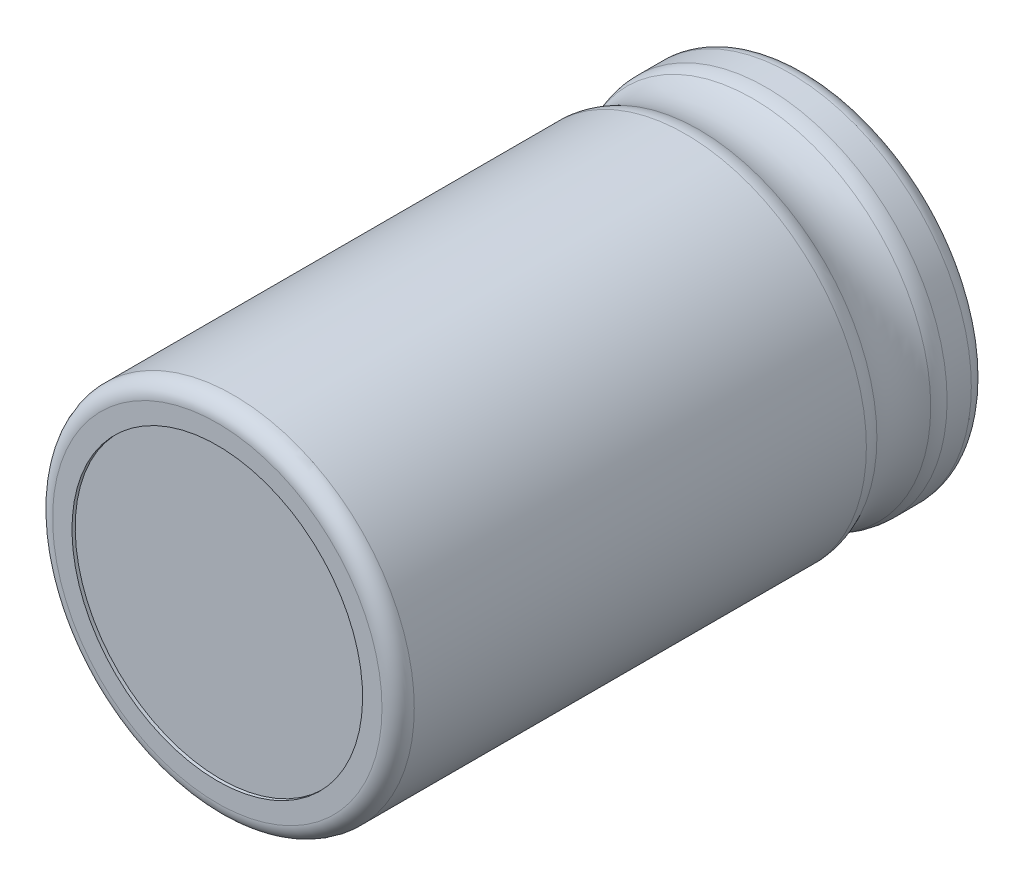
ISO-10303-21;
HEADER;
FILE_DESCRIPTION(('STEP AP214'),'2;1');
FILE_NAME('part.step','',(''),(''),'','','');
FILE_SCHEMA(('AUTOMOTIVE_DESIGN { 1 0 10303 214 1 1 1 1 }'));
ENDSEC;
DATA;
#1=APPLICATION_CONTEXT('core data for automotive mechanical design processes');
#2=APPLICATION_PROTOCOL_DEFINITION('international standard','automotive_design',2000,#1);
#3=PRODUCT_CONTEXT('',#1,'mechanical');
#4=PRODUCT('Part','Part','',(#3));
#5=PRODUCT_RELATED_PRODUCT_CATEGORY('part','',(#4));
#6=PRODUCT_DEFINITION_FORMATION('','',#4);
#7=PRODUCT_DEFINITION_CONTEXT('part definition',#1,'design');
#8=PRODUCT_DEFINITION('design','',#6,#7);
#9=PRODUCT_DEFINITION_SHAPE('','',#8);
#10=(LENGTH_UNIT() NAMED_UNIT(*) SI_UNIT(.MILLI.,.METRE.));
#11=(NAMED_UNIT(*) PLANE_ANGLE_UNIT() SI_UNIT($,.RADIAN.));
#12=(NAMED_UNIT(*) SI_UNIT($,.STERADIAN.) SOLID_ANGLE_UNIT());
#13=UNCERTAINTY_MEASURE_WITH_UNIT(LENGTH_MEASURE(1.E-05),#10,'distance_accuracy_value','');
#14=(GEOMETRIC_REPRESENTATION_CONTEXT(3) GLOBAL_UNCERTAINTY_ASSIGNED_CONTEXT((#13)) GLOBAL_UNIT_ASSIGNED_CONTEXT((#10,
#11,#12)) REPRESENTATION_CONTEXT('',''));
#15=CARTESIAN_POINT('',(0.,0.,0.));
#16=DIRECTION('',(0.,0.,1.));
#17=DIRECTION('',(1.,0.,0.));
#18=AXIS2_PLACEMENT_3D('',#15,#16,#17);
#19=CARTESIAN_POINT('',(-57.62,-38.4,-1.));
#20=DIRECTION('',(0.,0.,1.));
#21=DIRECTION('',(0.,-1.,0.));
#22=AXIS2_PLACEMENT_3D('',#19,#20,#21);
#23=PLANE('',#22);
#24=CARTESIAN_POINT('',(-57.62,-38.4,-1.));
#25=DIRECTION('',(0.,0.,1.));
#26=DIRECTION('',(0.,-1.,0.));
#27=AXIS2_PLACEMENT_3D('',#24,#25,#26);
#28=CIRCLE('',#27,0.5);
#29=CARTESIAN_POINT('',(-57.62,-38.9,-1.));
#30=VERTEX_POINT('',#29);
#31=EDGE_CURVE('E18',#30,#30,#28,.T.);
#32=ORIENTED_EDGE('',*,*,#31,.F.);
#33=EDGE_LOOP('',(#32));
#34=FACE_BOUND('',#33,.T.);
#35=ADVANCED_FACE('F15',(#34),#23,.F.);
#36=CARTESIAN_POINT('',(-67.78,-38.4,-1.));
#37=DIRECTION('',(0.,0.,1.));
#38=DIRECTION('',(0.,-1.,0.));
#39=AXIS2_PLACEMENT_3D('',#36,#37,#38);
#40=PLANE('',#39);
#41=CARTESIAN_POINT('',(-67.78,-38.4,-1.));
#42=DIRECTION('',(0.,0.,1.));
#43=DIRECTION('',(0.,-1.,0.));
#44=AXIS2_PLACEMENT_3D('',#41,#42,#43);
#45=CIRCLE('',#44,0.5);
#46=CARTESIAN_POINT('',(-67.78,-38.9,-1.));
#47=VERTEX_POINT('',#46);
#48=EDGE_CURVE('E128',#47,#47,#45,.T.);
#49=ORIENTED_EDGE('',*,*,#48,.F.);
#50=EDGE_LOOP('',(#49));
#51=FACE_BOUND('',#50,.T.);
#52=ADVANCED_FACE('F139',(#51),#40,.F.);
#53=CARTESIAN_POINT('',(-57.62,-38.4,1.5));
#54=DIRECTION('',(0.,0.,1.));
#55=DIRECTION('',(0.,-1.,0.));
#56=AXIS2_PLACEMENT_3D('',#53,#54,#55);
#57=CYLINDRICAL_SURFACE('',#56,0.5);
#58=ORIENTED_EDGE('',*,*,#31,.T.);
#59=EDGE_LOOP('',(#58));
#60=FACE_BOUND('',#59,.T.);
#61=CARTESIAN_POINT('',(-57.62,-38.4,1.5));
#62=DIRECTION('',(0.,0.,1.));
#63=DIRECTION('',(0.,-1.,0.));
#64=AXIS2_PLACEMENT_3D('',#61,#62,#63);
#65=CIRCLE('',#64,0.5);
#66=CARTESIAN_POINT('',(-57.62,-38.9,1.5));
#67=VERTEX_POINT('',#66);
#68=EDGE_CURVE('E126',#67,#67,#65,.T.);
#69=ORIENTED_EDGE('',*,*,#68,.F.);
#70=EDGE_LOOP('',(#69));
#71=FACE_BOUND('',#70,.T.);
#72=ADVANCED_FACE('F135',(#60,#71),#57,.T.);
#73=CARTESIAN_POINT('',(-67.78,-38.4,1.5));
#74=DIRECTION('',(0.,0.,1.));
#75=DIRECTION('',(0.,-1.,0.));
#76=AXIS2_PLACEMENT_3D('',#73,#74,#75);
#77=CYLINDRICAL_SURFACE('',#76,0.5);
#78=ORIENTED_EDGE('',*,*,#48,.T.);
#79=EDGE_LOOP('',(#78));
#80=FACE_BOUND('',#79,.T.);
#81=CARTESIAN_POINT('',(-67.78,-38.4,1.5));
#82=DIRECTION('',(0.,0.,1.));
#83=DIRECTION('',(0.,-1.,0.));
#84=AXIS2_PLACEMENT_3D('',#81,#82,#83);
#85=CIRCLE('',#84,0.5);
#86=CARTESIAN_POINT('',(-67.78,-38.9,1.5));
#87=VERTEX_POINT('',#86);
#88=EDGE_CURVE('E123',#87,#87,#85,.T.);
#89=ORIENTED_EDGE('',*,*,#88,.F.);
#90=EDGE_LOOP('',(#89));
#91=FACE_BOUND('',#90,.T.);
#92=ADVANCED_FACE('F194',(#80,#91),#77,.T.);
#93=CARTESIAN_POINT('',(-62.7,-38.4,1.5));
#94=DIRECTION('',(0.,0.,-1.));
#95=DIRECTION('',(0.,1.,0.));
#96=AXIS2_PLACEMENT_3D('',#93,#94,#95);
#97=PLANE('',#96);
#98=ORIENTED_EDGE('',*,*,#88,.T.);
#99=EDGE_LOOP('',(#98));
#100=FACE_BOUND('',#99,.T.);
#101=ORIENTED_EDGE('',*,*,#68,.T.);
#102=EDGE_LOOP('',(#101));
#103=FACE_BOUND('',#102,.T.);
#104=CARTESIAN_POINT('',(-62.7,-38.4,1.5));
#105=DIRECTION('',(0.,0.,1.));
#106=DIRECTION('',(1.,0.,0.));
#107=AXIS2_PLACEMENT_3D('',#104,#105,#106);
#108=CIRCLE('',#107,10.2);
#109=CARTESIAN_POINT('',(-52.5,-38.4,1.5));
#110=VERTEX_POINT('',#109);
#111=EDGE_CURVE('E92',#110,#110,#108,.T.);
#112=ORIENTED_EDGE('',*,*,#111,.F.);
#113=EDGE_LOOP('',(#112));
#114=FACE_BOUND('',#113,.T.);
#115=ADVANCED_FACE('F104',(#100,#103,#114),#97,.T.);
#116=CARTESIAN_POINT('',(-62.7,-38.4,2.5));
#117=DIRECTION('',(0.,0.,1.));
#118=DIRECTION('',(1.,0.,0.));
#119=AXIS2_PLACEMENT_3D('',#116,#117,#118);
#120=TOROIDAL_SURFACE('',#119,10.2,1.);
#121=CARTESIAN_POINT('',(-62.7,-38.4,2.5));
#122=DIRECTION('',(0.,0.,1.));
#123=DIRECTION('',(0.,-1.,0.));
#124=AXIS2_PLACEMENT_3D('',#121,#122,#123);
#125=CIRCLE('',#124,11.2);
#126=CARTESIAN_POINT('',(-62.7,-49.6,2.50000000000001));
#127=VERTEX_POINT('',#126);
#128=EDGE_CURVE('E89',#127,#127,#125,.T.);
#129=ORIENTED_EDGE('',*,*,#128,.F.);
#130=EDGE_LOOP('',(#129));
#131=FACE_BOUND('',#130,.T.);
#132=ORIENTED_EDGE('',*,*,#111,.T.);
#133=EDGE_LOOP('',(#132));
#134=FACE_BOUND('',#133,.T.);
#135=ADVANCED_FACE('F98',(#131,#134),#120,.T.);
#136=CARTESIAN_POINT('',(-62.7,-38.4,37.8));
#137=DIRECTION('',(0.,0.,-1.));
#138=DIRECTION('',(0.,1.,0.));
#139=AXIS2_PLACEMENT_3D('',#136,#137,#138);
#140=PLANE('',#139);
#141=CARTESIAN_POINT('',(-62.7,-38.4,37.8));
#142=DIRECTION('',(0.,0.,1.));
#143=DIRECTION('',(0.,-1.,0.));
#144=AXIS2_PLACEMENT_3D('',#141,#142,#143);
#145=CIRCLE('',#144,9.);
#146=CARTESIAN_POINT('',(-62.7,-47.4,37.8));
#147=VERTEX_POINT('',#146);
#148=EDGE_CURVE('E88',#147,#147,#145,.T.);
#149=ORIENTED_EDGE('',*,*,#148,.T.);
#150=EDGE_LOOP('',(#149));
#151=FACE_BOUND('',#150,.T.);
#152=ADVANCED_FACE('F103',(#151),#140,.F.);
#153=CARTESIAN_POINT('',(-62.7,-38.4,2.5));
#154=DIRECTION('',(0.,0.,1.));
#155=DIRECTION('',(0.,-1.,0.));
#156=AXIS2_PLACEMENT_3D('',#153,#154,#155);
#157=CYLINDRICAL_SURFACE('',#156,11.2);
#158=CARTESIAN_POINT('',(-62.7,-38.4,4.));
#159=DIRECTION('',(0.,0.,1.));
#160=DIRECTION('',(1.,0.,0.));
#161=AXIS2_PLACEMENT_3D('',#158,#159,#160);
#162=CIRCLE('',#161,11.2);
#163=CARTESIAN_POINT('',(-51.5,-38.4,4.));
#164=VERTEX_POINT('',#163);
#165=EDGE_CURVE('E85',#164,#164,#162,.T.);
#166=ORIENTED_EDGE('',*,*,#165,.F.);
#167=EDGE_LOOP('',(#166));
#168=FACE_BOUND('',#167,.T.);
#169=ORIENTED_EDGE('',*,*,#128,.T.);
#170=EDGE_LOOP('',(#169));
#171=FACE_BOUND('',#170,.T.);
#172=ADVANCED_FACE('F175',(#168,#171),#157,.T.);
#173=CARTESIAN_POINT('',(-62.7,-38.4,37.8));
#174=DIRECTION('',(0.,0.,1.));
#175=DIRECTION('',(0.,-1.,0.));
#176=AXIS2_PLACEMENT_3D('',#173,#174,#175);
#177=CYLINDRICAL_SURFACE('',#176,9.);
#178=CARTESIAN_POINT('',(-62.7,-38.4,38.));
#179=DIRECTION('',(0.,0.,1.));
#180=DIRECTION('',(0.,-1.,0.));
#181=AXIS2_PLACEMENT_3D('',#178,#179,#180);
#182=CIRCLE('',#181,9.);
#183=CARTESIAN_POINT('',(-62.7,-47.4,38.));
#184=VERTEX_POINT('',#183);
#185=EDGE_CURVE('E56',#184,#184,#182,.T.);
#186=ORIENTED_EDGE('',*,*,#185,.T.);
#187=EDGE_LOOP('',(#186));
#188=FACE_BOUND('',#187,.T.);
#189=ORIENTED_EDGE('',*,*,#148,.F.);
#190=EDGE_LOOP('',(#189));
#191=FACE_BOUND('',#190,.T.);
#192=ADVANCED_FACE('F78',(#188,#191),#177,.F.);
#193=CARTESIAN_POINT('',(-62.7,-38.4,4.));
#194=DIRECTION('',(0.,0.,1.));
#195=DIRECTION('',(1.,0.,0.));
#196=AXIS2_PLACEMENT_3D('',#193,#194,#195);
#197=TOROIDAL_SURFACE('',#196,9.2,2.);
#198=CARTESIAN_POINT('',(-62.7,-38.4,4.83333333333032));
#199=DIRECTION('',(0.,0.,1.));
#200=DIRECTION('',(1.,0.,0.));
#201=AXIS2_PLACEMENT_3D('',#198,#199,#200);
#202=CIRCLE('',#201,11.0181186857741);
#203=CARTESIAN_POINT('',(-51.6818813142259,-38.4,4.83333333333032));
#204=VERTEX_POINT('',#203);
#205=EDGE_CURVE('E52',#204,#204,#202,.F.);
#206=ORIENTED_EDGE('',*,*,#205,.T.);
#207=EDGE_LOOP('',(#206));
#208=FACE_BOUND('',#207,.T.);
#209=ORIENTED_EDGE('',*,*,#165,.T.);
#210=EDGE_LOOP('',(#209));
#211=FACE_BOUND('',#210,.T.);
#212=ADVANCED_FACE('F73',(#208,#211),#197,.T.);
#213=CARTESIAN_POINT('',(-62.7,-38.4,38.));
#214=DIRECTION('',(0.,0.,-1.));
#215=DIRECTION('',(0.,1.,0.));
#216=AXIS2_PLACEMENT_3D('',#213,#214,#215);
#217=PLANE('',#216);
#218=ORIENTED_EDGE('',*,*,#185,.F.);
#219=EDGE_LOOP('',(#218));
#220=FACE_BOUND('',#219,.T.);
#221=CARTESIAN_POINT('',(-62.7,-38.4,38.));
#222=DIRECTION('',(0.,0.,-1.));
#223=DIRECTION('',(1.,0.,0.));
#224=AXIS2_PLACEMENT_3D('',#221,#222,#223);
#225=CIRCLE('',#224,10.2);
#226=CARTESIAN_POINT('',(-52.5,-38.4,38.));
#227=VERTEX_POINT('',#226);
#228=EDGE_CURVE('E55',#227,#227,#225,.T.);
#229=ORIENTED_EDGE('',*,*,#228,.F.);
#230=EDGE_LOOP('',(#229));
#231=FACE_BOUND('',#230,.T.);
#232=ADVANCED_FACE('F64',(#220,#231),#217,.F.);
#233=CARTESIAN_POINT('',(-62.7,-38.4,6.5));
#234=DIRECTION('',(0.,0.,1.));
#235=DIRECTION('',(1.,0.,0.));
#236=AXIS2_PLACEMENT_3D('',#233,#234,#235);
#237=TOROIDAL_SURFACE('',#236,14.654356057318,4.);
#238=ORIENTED_EDGE('',*,*,#205,.F.);
#239=EDGE_LOOP('',(#238));
#240=FACE_BOUND('',#239,.T.);
#241=CARTESIAN_POINT('',(-62.7,-38.4,8.16666666666974));
#242=DIRECTION('',(0.,0.,1.));
#243=DIRECTION('',(1.,0.,0.));
#244=AXIS2_PLACEMENT_3D('',#241,#242,#243);
#245=CIRCLE('',#244,11.018118685774);
#246=CARTESIAN_POINT('',(-51.681881314226,-38.4,8.16666666666974));
#247=VERTEX_POINT('',#246);
#248=EDGE_CURVE('E27',#247,#247,#245,.T.);
#249=ORIENTED_EDGE('',*,*,#248,.F.);
#250=EDGE_LOOP('',(#249));
#251=FACE_BOUND('',#250,.T.);
#252=ADVANCED_FACE('F44',(#240,#251),#237,.F.);
#253=CARTESIAN_POINT('',(-62.7,-38.4,37.));
#254=DIRECTION('',(0.,0.,1.));
#255=DIRECTION('',(1.,0.,0.));
#256=AXIS2_PLACEMENT_3D('',#253,#254,#255);
#257=TOROIDAL_SURFACE('',#256,10.2,1.);
#258=ORIENTED_EDGE('',*,*,#228,.T.);
#259=EDGE_LOOP('',(#258));
#260=FACE_BOUND('',#259,.T.);
#261=CARTESIAN_POINT('',(-62.7,-38.4,37.));
#262=DIRECTION('',(0.,0.,1.));
#263=DIRECTION('',(0.,-1.,0.));
#264=AXIS2_PLACEMENT_3D('',#261,#262,#263);
#265=CIRCLE('',#264,11.2);
#266=CARTESIAN_POINT('',(-62.7,-49.6,37.));
#267=VERTEX_POINT('',#266);
#268=EDGE_CURVE('E22',#267,#267,#265,.F.);
#269=ORIENTED_EDGE('',*,*,#268,.F.);
#270=EDGE_LOOP('',(#269));
#271=FACE_BOUND('',#270,.T.);
#272=ADVANCED_FACE('F39',(#260,#271),#257,.T.);
#273=CARTESIAN_POINT('',(-62.7,-38.4,9.));
#274=DIRECTION('',(0.,0.,1.));
#275=DIRECTION('',(1.,0.,0.));
#276=AXIS2_PLACEMENT_3D('',#273,#274,#275);
#277=TOROIDAL_SURFACE('',#276,9.2,2.);
#278=CARTESIAN_POINT('',(-62.7,-38.4,9.));
#279=DIRECTION('',(0.,0.,1.));
#280=DIRECTION('',(0.,-1.,0.));
#281=AXIS2_PLACEMENT_3D('',#278,#279,#280);
#282=CIRCLE('',#281,11.2);
#283=CARTESIAN_POINT('',(-62.7,-49.6,9.00000000000001));
#284=VERTEX_POINT('',#283);
#285=EDGE_CURVE('E10',#284,#284,#282,.T.);
#286=ORIENTED_EDGE('',*,*,#285,.F.);
#287=EDGE_LOOP('',(#286));
#288=FACE_BOUND('',#287,.T.);
#289=ORIENTED_EDGE('',*,*,#248,.T.);
#290=EDGE_LOOP('',(#289));
#291=FACE_BOUND('',#290,.T.);
#292=ADVANCED_FACE('F34',(#288,#291),#277,.T.);
#293=CARTESIAN_POINT('',(-62.7,-38.4,9.));
#294=DIRECTION('',(0.,0.,1.));
#295=DIRECTION('',(0.,-1.,0.));
#296=AXIS2_PLACEMENT_3D('',#293,#294,#295);
#297=CYLINDRICAL_SURFACE('',#296,11.2);
#298=ORIENTED_EDGE('',*,*,#268,.T.);
#299=EDGE_LOOP('',(#298));
#300=FACE_BOUND('',#299,.T.);
#301=ORIENTED_EDGE('',*,*,#285,.T.);
#302=EDGE_LOOP('',(#301));
#303=FACE_BOUND('',#302,.T.);
#304=ADVANCED_FACE('F38',(#300,#303),#297,.T.);
#305=CLOSED_SHELL('',(#35,#52,#72,#92,#115,#135,#152,#172,#192,#212,#232,#252,#272,#292,#304));
#306=MANIFOLD_SOLID_BREP('B1',#305);
#307=ADVANCED_BREP_SHAPE_REPRESENTATION('',(#18,#306),#14);
#308=SHAPE_DEFINITION_REPRESENTATION(#9,#307);
ENDSEC;
END-ISO-10303-21;
